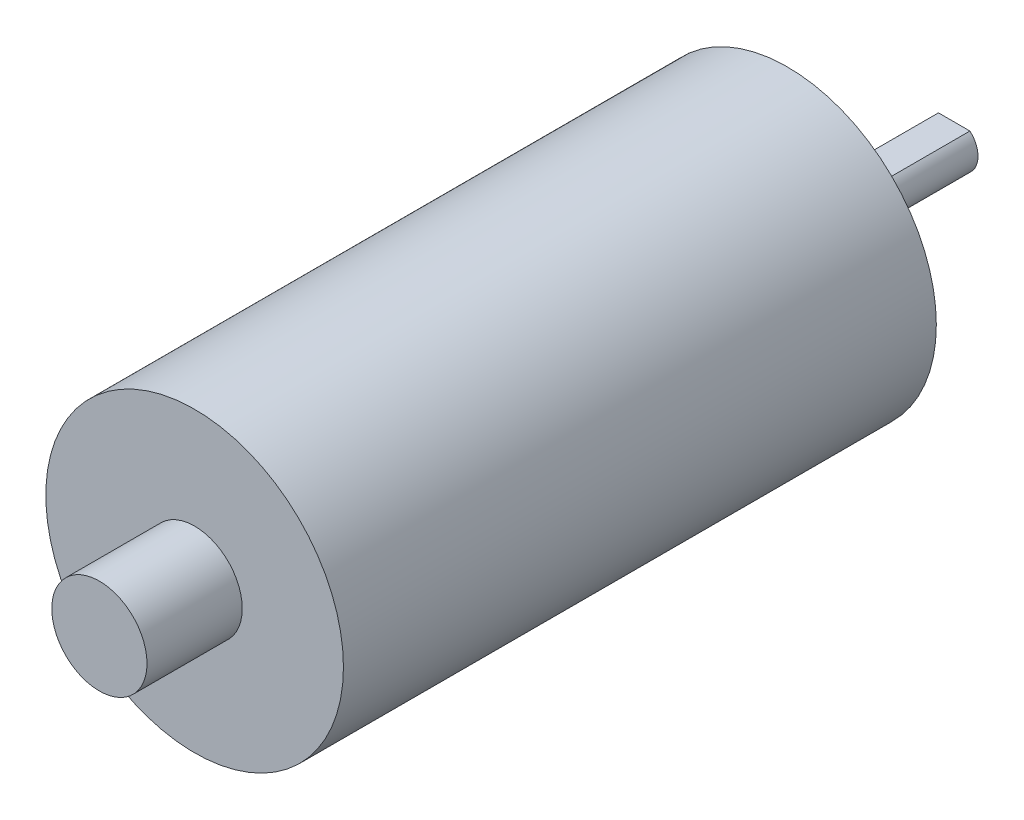
ISO-10303-21;
HEADER;
FILE_DESCRIPTION(('STEP AP214'),'2;1');
FILE_NAME('part.step','',(''),(''),'','','');
FILE_SCHEMA(('AUTOMOTIVE_DESIGN { 1 0 10303 214 1 1 1 1 }'));
ENDSEC;
DATA;
#1=APPLICATION_CONTEXT('core data for automotive mechanical design processes');
#2=APPLICATION_PROTOCOL_DEFINITION('international standard','automotive_design',2000,#1);
#3=PRODUCT_CONTEXT('',#1,'mechanical');
#4=PRODUCT('Part','Part','',(#3));
#5=PRODUCT_RELATED_PRODUCT_CATEGORY('part','',(#4));
#6=PRODUCT_DEFINITION_FORMATION('','',#4);
#7=PRODUCT_DEFINITION_CONTEXT('part definition',#1,'design');
#8=PRODUCT_DEFINITION('design','',#6,#7);
#9=PRODUCT_DEFINITION_SHAPE('','',#8);
#10=(LENGTH_UNIT() NAMED_UNIT(*) SI_UNIT(.MILLI.,.METRE.));
#11=(NAMED_UNIT(*) PLANE_ANGLE_UNIT() SI_UNIT($,.RADIAN.));
#12=(NAMED_UNIT(*) SI_UNIT($,.STERADIAN.) SOLID_ANGLE_UNIT());
#13=UNCERTAINTY_MEASURE_WITH_UNIT(LENGTH_MEASURE(1.E-05),#10,'distance_accuracy_value','');
#14=(GEOMETRIC_REPRESENTATION_CONTEXT(3) GLOBAL_UNCERTAINTY_ASSIGNED_CONTEXT((#13)) GLOBAL_UNIT_ASSIGNED_CONTEXT((#10,
#11,#12)) REPRESENTATION_CONTEXT('',''));
#15=CARTESIAN_POINT('',(0.,0.,0.));
#16=DIRECTION('',(0.,0.,1.));
#17=DIRECTION('',(1.,0.,0.));
#18=AXIS2_PLACEMENT_3D('',#15,#16,#17);
#19=CARTESIAN_POINT('',(0.,0.,-14.));
#20=DIRECTION('',(0.,0.,1.));
#21=DIRECTION('',(1.,0.,0.));
#22=AXIS2_PLACEMENT_3D('',#19,#20,#21);
#23=CYLINDRICAL_SURFACE('',#22,2.);
#24=CARTESIAN_POINT('',(0.,0.,-2.5));
#25=DIRECTION('',(0.,0.,-1.));
#26=DIRECTION('',(-1.,0.,0.));
#27=AXIS2_PLACEMENT_3D('',#24,#25,#26);
#28=CIRCLE('',#27,2.);
#29=CARTESIAN_POINT('',(-2.,0.,-2.5));
#30=VERTEX_POINT('',#29);
#31=EDGE_CURVE('E44',#30,#30,#28,.T.);
#32=ORIENTED_EDGE('',*,*,#31,.T.);
#33=EDGE_LOOP('',(#32));
#34=FACE_BOUND('',#33,.T.);
#35=DIRECTION('',(0.,0.,-1.));
#36=VECTOR('',#35,1.);
#37=CARTESIAN_POINT('',(-1.3228756555323,1.5,-5.));
#38=LINE('',#37,#36);
#39=CARTESIAN_POINT('',(-1.3228756555323,1.5,-5.));
#40=VERTEX_POINT('',#39);
#41=CARTESIAN_POINT('',(-1.3228756555323,1.5,-14.));
#42=VERTEX_POINT('',#41);
#43=EDGE_CURVE('E65',#40,#42,#38,.T.);
#44=ORIENTED_EDGE('',*,*,#43,.T.);
#45=CARTESIAN_POINT('',(0.,0.,-14.));
#46=DIRECTION('',(0.,0.,-1.));
#47=DIRECTION('',(-1.,0.,0.));
#48=AXIS2_PLACEMENT_3D('',#45,#46,#47);
#49=CIRCLE('',#48,2.);
#50=CARTESIAN_POINT('',(1.3228756555323,1.5,-14.));
#51=VERTEX_POINT('',#50);
#52=EDGE_CURVE('E73',#51,#42,#49,.T.);
#53=ORIENTED_EDGE('',*,*,#52,.F.);
#54=DIRECTION('',(0.,0.,-1.));
#55=VECTOR('',#54,1.);
#56=CARTESIAN_POINT('',(1.3228756555323,1.5,-5.));
#57=LINE('',#56,#55);
#58=CARTESIAN_POINT('',(1.3228756555323,1.5,-5.));
#59=VERTEX_POINT('',#58);
#60=EDGE_CURVE('E52',#59,#51,#57,.T.);
#61=ORIENTED_EDGE('',*,*,#60,.F.);
#62=CARTESIAN_POINT('',(0.,0.,-5.));
#63=DIRECTION('',(0.,0.,-1.));
#64=DIRECTION('',(-1.,0.,0.));
#65=AXIS2_PLACEMENT_3D('',#62,#63,#64);
#66=CIRCLE('',#65,2.);
#67=EDGE_CURVE('E74',#40,#59,#66,.T.);
#68=ORIENTED_EDGE('',*,*,#67,.F.);
#69=EDGE_LOOP('',(#44,#53,#61,#68));
#70=FACE_BOUND('',#69,.T.);
#71=ADVANCED_FACE('F35',(#34,#70),#23,.T.);
#72=CARTESIAN_POINT('',(0.,0.,-14.));
#73=DIRECTION('',(0.,0.,-1.));
#74=DIRECTION('',(-1.,0.,0.));
#75=AXIS2_PLACEMENT_3D('',#72,#73,#74);
#76=PLANE('',#75);
#77=ORIENTED_EDGE('',*,*,#52,.T.);
#78=DIRECTION('',(1.,0.,0.));
#79=VECTOR('',#78,1.);
#80=CARTESIAN_POINT('',(0.,1.5,-14.));
#81=LINE('',#80,#79);
#82=EDGE_CURVE('E62',#42,#51,#81,.T.);
#83=ORIENTED_EDGE('',*,*,#82,.T.);
#84=EDGE_LOOP('',(#77,#83));
#85=FACE_BOUND('',#84,.T.);
#86=ADVANCED_FACE('F76',(#85),#76,.T.);
#87=CARTESIAN_POINT('',(0.,0.,49.8));
#88=DIRECTION('',(0.,0.,-1.));
#89=DIRECTION('',(-1.,0.,0.));
#90=AXIS2_PLACEMENT_3D('',#87,#88,#89);
#91=CYLINDRICAL_SURFACE('',#90,12.5);
#92=CARTESIAN_POINT('',(0.,0.,49.8));
#93=DIRECTION('',(0.,0.,1.));
#94=DIRECTION('',(1.,0.,0.));
#95=AXIS2_PLACEMENT_3D('',#92,#93,#94);
#96=CIRCLE('',#95,12.5);
#97=CARTESIAN_POINT('',(12.5,0.,49.8));
#98=VERTEX_POINT('',#97);
#99=EDGE_CURVE('E87',#98,#98,#96,.T.);
#100=ORIENTED_EDGE('',*,*,#99,.F.);
#101=EDGE_LOOP('',(#100));
#102=FACE_BOUND('',#101,.T.);
#103=CARTESIAN_POINT('',(0.,0.,0.));
#104=DIRECTION('',(0.,0.,1.));
#105=DIRECTION('',(1.,0.,0.));
#106=AXIS2_PLACEMENT_3D('',#103,#104,#105);
#107=CIRCLE('',#106,12.5);
#108=CARTESIAN_POINT('',(12.5,0.,0.));
#109=VERTEX_POINT('',#108);
#110=EDGE_CURVE('E39',#109,#109,#107,.T.);
#111=ORIENTED_EDGE('',*,*,#110,.T.);
#112=EDGE_LOOP('',(#111));
#113=FACE_BOUND('',#112,.T.);
#114=ADVANCED_FACE('F37',(#102,#113),#91,.T.);
#115=CARTESIAN_POINT('',(0.,0.,49.8));
#116=DIRECTION('',(0.,0.,1.));
#117=DIRECTION('',(1.,0.,0.));
#118=AXIS2_PLACEMENT_3D('',#115,#116,#117);
#119=PLANE('',#118);
#120=CARTESIAN_POINT('',(0.,0.,49.8));
#121=DIRECTION('',(0.,0.,1.));
#122=DIRECTION('',(1.,0.,0.));
#123=AXIS2_PLACEMENT_3D('',#120,#121,#122);
#124=CIRCLE('',#123,4.);
#125=CARTESIAN_POINT('',(4.,0.,49.8));
#126=VERTEX_POINT('',#125);
#127=EDGE_CURVE('E11',#126,#126,#124,.T.);
#128=ORIENTED_EDGE('',*,*,#127,.F.);
#129=EDGE_LOOP('',(#128));
#130=FACE_BOUND('',#129,.T.);
#131=ORIENTED_EDGE('',*,*,#99,.T.);
#132=EDGE_LOOP('',(#131));
#133=FACE_BOUND('',#132,.T.);
#134=ADVANCED_FACE('F98',(#130,#133),#119,.T.);
#135=CARTESIAN_POINT('',(0.,0.,0.));
#136=DIRECTION('',(0.,0.,1.));
#137=DIRECTION('',(1.,0.,0.));
#138=AXIS2_PLACEMENT_3D('',#135,#136,#137);
#139=PLANE('',#138);
#140=CARTESIAN_POINT('',(-8.5,0.,0.));
#141=DIRECTION('',(0.,0.,-1.));
#142=DIRECTION('',(-1.,0.,0.));
#143=AXIS2_PLACEMENT_3D('',#140,#141,#142);
#144=CIRCLE('',#143,1.5);
#145=CARTESIAN_POINT('',(-10.,0.,0.));
#146=VERTEX_POINT('',#145);
#147=EDGE_CURVE('E175',#146,#146,#144,.T.);
#148=ORIENTED_EDGE('',*,*,#147,.F.);
#149=EDGE_LOOP('',(#148));
#150=FACE_BOUND('',#149,.T.);
#151=CARTESIAN_POINT('',(8.5,0.,0.));
#152=DIRECTION('',(0.,0.,-1.));
#153=DIRECTION('',(1.,0.,0.));
#154=AXIS2_PLACEMENT_3D('',#151,#152,#153);
#155=CIRCLE('',#154,1.5);
#156=CARTESIAN_POINT('',(10.,0.,0.));
#157=VERTEX_POINT('',#156);
#158=EDGE_CURVE('E167',#157,#157,#155,.T.);
#159=ORIENTED_EDGE('',*,*,#158,.F.);
#160=EDGE_LOOP('',(#159));
#161=FACE_BOUND('',#160,.T.);
#162=CARTESIAN_POINT('',(0.,0.,0.));
#163=DIRECTION('',(0.,0.,-1.));
#164=DIRECTION('',(-1.,0.,0.));
#165=AXIS2_PLACEMENT_3D('',#162,#163,#164);
#166=CIRCLE('',#165,3.5);
#167=CARTESIAN_POINT('',(-3.5,0.,0.));
#168=VERTEX_POINT('',#167);
#169=EDGE_CURVE('E84',#168,#168,#166,.T.);
#170=ORIENTED_EDGE('',*,*,#169,.F.);
#171=EDGE_LOOP('',(#170));
#172=FACE_BOUND('',#171,.T.);
#173=ORIENTED_EDGE('',*,*,#110,.F.);
#174=EDGE_LOOP('',(#173));
#175=FACE_BOUND('',#174,.T.);
#176=ADVANCED_FACE('F95',(#150,#161,#172,#175),#139,.F.);
#177=CARTESIAN_POINT('',(0.,0.,-2.5));
#178=DIRECTION('',(0.,0.,1.));
#179=DIRECTION('',(1.,0.,0.));
#180=AXIS2_PLACEMENT_3D('',#177,#178,#179);
#181=CYLINDRICAL_SURFACE('',#180,3.5);
#182=CARTESIAN_POINT('',(0.,0.,-2.5));
#183=DIRECTION('',(0.,0.,-1.));
#184=DIRECTION('',(-1.,0.,0.));
#185=AXIS2_PLACEMENT_3D('',#182,#183,#184);
#186=CIRCLE('',#185,3.5);
#187=CARTESIAN_POINT('',(-3.5,0.,-2.5));
#188=VERTEX_POINT('',#187);
#189=EDGE_CURVE('E77',#188,#188,#186,.T.);
#190=ORIENTED_EDGE('',*,*,#189,.F.);
#191=EDGE_LOOP('',(#190));
#192=FACE_BOUND('',#191,.T.);
#193=ORIENTED_EDGE('',*,*,#169,.T.);
#194=EDGE_LOOP('',(#193));
#195=FACE_BOUND('',#194,.T.);
#196=ADVANCED_FACE('F97',(#192,#195),#181,.T.);
#197=CARTESIAN_POINT('',(0.,0.,-2.5));
#198=DIRECTION('',(0.,0.,-1.));
#199=DIRECTION('',(-1.,0.,0.));
#200=AXIS2_PLACEMENT_3D('',#197,#198,#199);
#201=PLANE('',#200);
#202=ORIENTED_EDGE('',*,*,#31,.F.);
#203=EDGE_LOOP('',(#202));
#204=FACE_BOUND('',#203,.T.);
#205=ORIENTED_EDGE('',*,*,#189,.T.);
#206=EDGE_LOOP('',(#205));
#207=FACE_BOUND('',#206,.T.);
#208=ADVANCED_FACE('F104',(#204,#207),#201,.T.);
#209=CARTESIAN_POINT('',(0.,1.5,-5.));
#210=DIRECTION('',(0.,1.,0.));
#211=DIRECTION('',(-1.,0.,0.));
#212=AXIS2_PLACEMENT_3D('',#209,#210,#211);
#213=PLANE('',#212);
#214=ORIENTED_EDGE('',*,*,#82,.F.);
#215=ORIENTED_EDGE('',*,*,#43,.F.);
#216=DIRECTION('',(1.,0.,0.));
#217=VECTOR('',#216,1.);
#218=CARTESIAN_POINT('',(0.,1.5,-5.));
#219=LINE('',#218,#217);
#220=EDGE_CURVE('E58',#40,#59,#219,.T.);
#221=ORIENTED_EDGE('',*,*,#220,.T.);
#222=ORIENTED_EDGE('',*,*,#60,.T.);
#223=EDGE_LOOP('',(#214,#215,#221,#222));
#224=FACE_BOUND('',#223,.T.);
#225=ADVANCED_FACE('F64',(#224),#213,.T.);
#226=CARTESIAN_POINT('',(0.,0.,-5.));
#227=DIRECTION('',(0.,0.,-1.));
#228=DIRECTION('',(-1.,0.,0.));
#229=AXIS2_PLACEMENT_3D('',#226,#227,#228);
#230=PLANE('',#229);
#231=ORIENTED_EDGE('',*,*,#220,.F.);
#232=ORIENTED_EDGE('',*,*,#67,.T.);
#233=EDGE_LOOP('',(#231,#232));
#234=FACE_BOUND('',#233,.T.);
#235=ADVANCED_FACE('F126',(#234),#230,.T.);
#236=CARTESIAN_POINT('',(8.5,0.,3.));
#237=DIRECTION('',(0.,0.,-1.));
#238=DIRECTION('',(-1.,0.,0.));
#239=AXIS2_PLACEMENT_3D('',#236,#237,#238);
#240=CYLINDRICAL_SURFACE('',#239,1.5);
#241=CARTESIAN_POINT('',(8.5,0.,3.));
#242=DIRECTION('',(0.,0.,-1.));
#243=DIRECTION('',(1.,0.,0.));
#244=AXIS2_PLACEMENT_3D('',#241,#242,#243);
#245=CIRCLE('',#244,1.5);
#246=CARTESIAN_POINT('',(10.,0.,3.));
#247=VERTEX_POINT('',#246);
#248=EDGE_CURVE('E170',#247,#247,#245,.T.);
#249=ORIENTED_EDGE('',*,*,#248,.F.);
#250=EDGE_LOOP('',(#249));
#251=FACE_BOUND('',#250,.T.);
#252=ORIENTED_EDGE('',*,*,#158,.T.);
#253=EDGE_LOOP('',(#252));
#254=FACE_BOUND('',#253,.T.);
#255=ADVANCED_FACE('F136',(#251,#254),#240,.F.);
#256=CARTESIAN_POINT('',(8.5,0.,3.));
#257=DIRECTION('',(0.,0.,1.));
#258=DIRECTION('',(1.,0.,0.));
#259=AXIS2_PLACEMENT_3D('',#256,#257,#258);
#260=PLANE('',#259);
#261=ORIENTED_EDGE('',*,*,#248,.T.);
#262=EDGE_LOOP('',(#261));
#263=FACE_BOUND('',#262,.T.);
#264=ADVANCED_FACE('F142',(#263),#260,.F.);
#265=CARTESIAN_POINT('',(-8.5,0.,3.));
#266=DIRECTION('',(0.,0.,-1.));
#267=DIRECTION('',(-1.,0.,0.));
#268=AXIS2_PLACEMENT_3D('',#265,#266,#267);
#269=CYLINDRICAL_SURFACE('',#268,1.5);
#270=CARTESIAN_POINT('',(-8.5,0.,3.));
#271=DIRECTION('',(0.,0.,-1.));
#272=DIRECTION('',(-1.,0.,0.));
#273=AXIS2_PLACEMENT_3D('',#270,#271,#272);
#274=CIRCLE('',#273,1.5);
#275=CARTESIAN_POINT('',(-10.,0.,3.));
#276=VERTEX_POINT('',#275);
#277=EDGE_CURVE('E69',#276,#276,#274,.T.);
#278=ORIENTED_EDGE('',*,*,#277,.F.);
#279=EDGE_LOOP('',(#278));
#280=FACE_BOUND('',#279,.T.);
#281=ORIENTED_EDGE('',*,*,#147,.T.);
#282=EDGE_LOOP('',(#281));
#283=FACE_BOUND('',#282,.T.);
#284=ADVANCED_FACE('F146',(#280,#283),#269,.F.);
#285=CARTESIAN_POINT('',(-8.5,0.,3.));
#286=DIRECTION('',(0.,0.,-1.));
#287=DIRECTION('',(-1.,0.,0.));
#288=AXIS2_PLACEMENT_3D('',#285,#286,#287);
#289=PLANE('',#288);
#290=ORIENTED_EDGE('',*,*,#277,.T.);
#291=EDGE_LOOP('',(#290));
#292=FACE_BOUND('',#291,.T.);
#293=ADVANCED_FACE('F150',(#292),#289,.T.);
#294=CARTESIAN_POINT('',(0.,0.,57.8));
#295=DIRECTION('',(0.,0.,-1.));
#296=DIRECTION('',(-1.,0.,0.));
#297=AXIS2_PLACEMENT_3D('',#294,#295,#296);
#298=CYLINDRICAL_SURFACE('',#297,4.);
#299=CARTESIAN_POINT('',(0.,0.,57.8));
#300=DIRECTION('',(0.,0.,1.));
#301=DIRECTION('',(1.,0.,0.));
#302=AXIS2_PLACEMENT_3D('',#299,#300,#301);
#303=CIRCLE('',#302,4.);
#304=CARTESIAN_POINT('',(4.,0.,57.8));
#305=VERTEX_POINT('',#304);
#306=EDGE_CURVE('E166',#305,#305,#303,.T.);
#307=ORIENTED_EDGE('',*,*,#306,.F.);
#308=EDGE_LOOP('',(#307));
#309=FACE_BOUND('',#308,.T.);
#310=ORIENTED_EDGE('',*,*,#127,.T.);
#311=EDGE_LOOP('',(#310));
#312=FACE_BOUND('',#311,.T.);
#313=ADVANCED_FACE('F154',(#309,#312),#298,.T.);
#314=CARTESIAN_POINT('',(0.,0.,57.8));
#315=DIRECTION('',(0.,0.,1.));
#316=DIRECTION('',(1.,0.,0.));
#317=AXIS2_PLACEMENT_3D('',#314,#315,#316);
#318=PLANE('',#317);
#319=ORIENTED_EDGE('',*,*,#306,.T.);
#320=EDGE_LOOP('',(#319));
#321=FACE_BOUND('',#320,.T.);
#322=ADVANCED_FACE('F158',(#321),#318,.T.);
#323=CLOSED_SHELL('',(#71,#86,#114,#134,#176,#196,#208,#225,#235,#255,#264,#284,#293,#313,#322));
#324=MANIFOLD_SOLID_BREP('B2',#323);
#325=ADVANCED_BREP_SHAPE_REPRESENTATION('',(#18,#324),#14);
#326=SHAPE_DEFINITION_REPRESENTATION(#9,#325);
ENDSEC;
END-ISO-10303-21;
